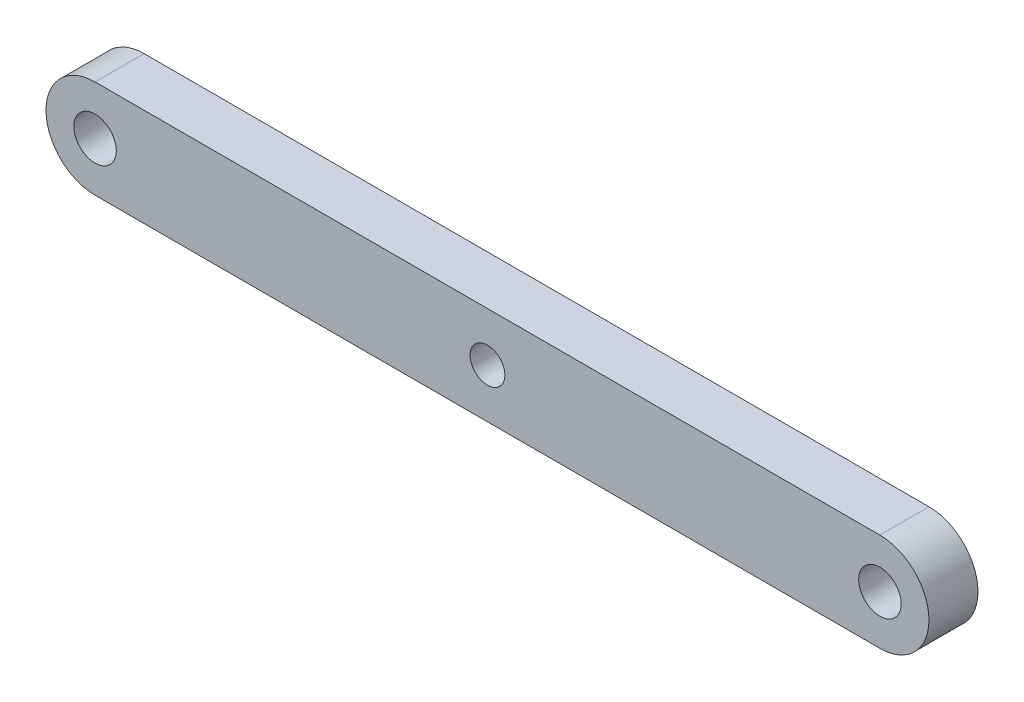
ISO-10303-21;
HEADER;
FILE_DESCRIPTION(('STEP AP214'),'2;1');
FILE_NAME('part.step','',(''),(''),'','','');
FILE_SCHEMA(('AUTOMOTIVE_DESIGN { 1 0 10303 214 1 1 1 1 }'));
ENDSEC;
DATA;
#1=APPLICATION_CONTEXT('core data for automotive mechanical design processes');
#2=APPLICATION_PROTOCOL_DEFINITION('international standard','automotive_design',2000,#1);
#3=PRODUCT_CONTEXT('',#1,'mechanical');
#4=PRODUCT('Part','Part','',(#3));
#5=PRODUCT_RELATED_PRODUCT_CATEGORY('part','',(#4));
#6=PRODUCT_DEFINITION_FORMATION('','',#4);
#7=PRODUCT_DEFINITION_CONTEXT('part definition',#1,'design');
#8=PRODUCT_DEFINITION('design','',#6,#7);
#9=PRODUCT_DEFINITION_SHAPE('','',#8);
#10=(LENGTH_UNIT() NAMED_UNIT(*) SI_UNIT(.MILLI.,.METRE.));
#11=(NAMED_UNIT(*) PLANE_ANGLE_UNIT() SI_UNIT($,.RADIAN.));
#12=(NAMED_UNIT(*) SI_UNIT($,.STERADIAN.) SOLID_ANGLE_UNIT());
#13=UNCERTAINTY_MEASURE_WITH_UNIT(LENGTH_MEASURE(1.E-05),#10,'distance_accuracy_value','');
#14=(GEOMETRIC_REPRESENTATION_CONTEXT(3) GLOBAL_UNCERTAINTY_ASSIGNED_CONTEXT((#13)) GLOBAL_UNIT_ASSIGNED_CONTEXT((#10,
#11,#12)) REPRESENTATION_CONTEXT('',''));
#15=CARTESIAN_POINT('',(0.,0.,0.));
#16=DIRECTION('',(0.,0.,1.));
#17=DIRECTION('',(1.,0.,0.));
#18=AXIS2_PLACEMENT_3D('',#15,#16,#17);
#19=CARTESIAN_POINT('',(0.,0.,6.35));
#20=DIRECTION('',(0.,0.,-1.));
#21=DIRECTION('',(-1.,0.,0.));
#22=AXIS2_PLACEMENT_3D('',#19,#20,#21);
#23=CYLINDRICAL_SURFACE('',#22,6.35);
#24=CARTESIAN_POINT('',(0.,0.,0.));
#25=DIRECTION('',(0.,0.,1.));
#26=DIRECTION('',(1.,0.,0.));
#27=AXIS2_PLACEMENT_3D('',#24,#25,#26);
#28=CIRCLE('',#27,6.35);
#29=CARTESIAN_POINT('',(0.,6.35,0.));
#30=VERTEX_POINT('',#29);
#31=CARTESIAN_POINT('',(0.,-6.35,0.));
#32=VERTEX_POINT('',#31);
#33=EDGE_CURVE('E96',#30,#32,#28,.T.);
#34=ORIENTED_EDGE('',*,*,#33,.T.);
#35=DIRECTION('',(0.,0.,-1.));
#36=VECTOR('',#35,1.);
#37=CARTESIAN_POINT('',(0.,-6.35,6.35));
#38=LINE('',#37,#36);
#39=CARTESIAN_POINT('',(0.,-6.35,6.35));
#40=VERTEX_POINT('',#39);
#41=EDGE_CURVE('E11',#40,#32,#38,.T.);
#42=ORIENTED_EDGE('',*,*,#41,.F.);
#43=CARTESIAN_POINT('',(0.,0.,6.35));
#44=DIRECTION('',(0.,0.,1.));
#45=DIRECTION('',(1.,0.,0.));
#46=AXIS2_PLACEMENT_3D('',#43,#44,#45);
#47=CIRCLE('',#46,6.35);
#48=CARTESIAN_POINT('',(0.,6.35,6.35));
#49=VERTEX_POINT('',#48);
#50=EDGE_CURVE('E84',#49,#40,#47,.T.);
#51=ORIENTED_EDGE('',*,*,#50,.F.);
#52=DIRECTION('',(0.,0.,-1.));
#53=VECTOR('',#52,1.);
#54=CARTESIAN_POINT('',(0.,6.35,6.35));
#55=LINE('',#54,#53);
#56=EDGE_CURVE('E92',#49,#30,#55,.T.);
#57=ORIENTED_EDGE('',*,*,#56,.T.);
#58=EDGE_LOOP('',(#34,#42,#51,#57));
#59=FACE_BOUND('',#58,.T.);
#60=ADVANCED_FACE('F33',(#59),#23,.T.);
#61=CARTESIAN_POINT('',(0.,-6.35,6.35));
#62=DIRECTION('',(0.,1.,0.));
#63=DIRECTION('',(0.,0.,1.));
#64=AXIS2_PLACEMENT_3D('',#61,#62,#63);
#65=PLANE('',#64);
#66=DIRECTION('',(1.,0.,0.));
#67=VECTOR('',#66,1.);
#68=CARTESIAN_POINT('',(0.,-6.35,0.));
#69=LINE('',#68,#67);
#70=CARTESIAN_POINT('',(101.6,-6.35,0.));
#71=VERTEX_POINT('',#70);
#72=EDGE_CURVE('E88',#32,#71,#69,.T.);
#73=ORIENTED_EDGE('',*,*,#72,.T.);
#74=DIRECTION('',(0.,0.,-1.));
#75=VECTOR('',#74,1.);
#76=CARTESIAN_POINT('',(101.6,-6.35,6.35));
#77=LINE('',#76,#75);
#78=CARTESIAN_POINT('',(101.6,-6.35,6.35));
#79=VERTEX_POINT('',#78);
#80=EDGE_CURVE('E41',#79,#71,#77,.T.);
#81=ORIENTED_EDGE('',*,*,#80,.F.);
#82=DIRECTION('',(1.,0.,0.));
#83=VECTOR('',#82,1.);
#84=CARTESIAN_POINT('',(0.,-6.35,6.35));
#85=LINE('',#84,#83);
#86=EDGE_CURVE('E79',#40,#79,#85,.T.);
#87=ORIENTED_EDGE('',*,*,#86,.F.);
#88=ORIENTED_EDGE('',*,*,#41,.T.);
#89=EDGE_LOOP('',(#73,#81,#87,#88));
#90=FACE_BOUND('',#89,.T.);
#91=ADVANCED_FACE('F87',(#90),#65,.F.);
#92=CARTESIAN_POINT('',(101.6,0.,6.35));
#93=DIRECTION('',(0.,0.,-1.));
#94=DIRECTION('',(-1.,0.,0.));
#95=AXIS2_PLACEMENT_3D('',#92,#93,#94);
#96=CYLINDRICAL_SURFACE('',#95,6.35);
#97=CARTESIAN_POINT('',(101.6,0.,0.));
#98=DIRECTION('',(0.,0.,1.));
#99=DIRECTION('',(1.,0.,0.));
#100=AXIS2_PLACEMENT_3D('',#97,#98,#99);
#101=CIRCLE('',#100,6.35);
#102=CARTESIAN_POINT('',(101.6,6.35,0.));
#103=VERTEX_POINT('',#102);
#104=EDGE_CURVE('E66',#71,#103,#101,.T.);
#105=ORIENTED_EDGE('',*,*,#104,.T.);
#106=DIRECTION('',(0.,0.,-1.));
#107=VECTOR('',#106,1.);
#108=CARTESIAN_POINT('',(101.6,6.35,6.35));
#109=LINE('',#108,#107);
#110=CARTESIAN_POINT('',(101.6,6.35,6.35));
#111=VERTEX_POINT('',#110);
#112=EDGE_CURVE('E89',#111,#103,#109,.T.);
#113=ORIENTED_EDGE('',*,*,#112,.F.);
#114=CARTESIAN_POINT('',(101.6,0.,6.35));
#115=DIRECTION('',(0.,0.,1.));
#116=DIRECTION('',(1.,0.,0.));
#117=AXIS2_PLACEMENT_3D('',#114,#115,#116);
#118=CIRCLE('',#117,6.35);
#119=EDGE_CURVE('E82',#79,#111,#118,.T.);
#120=ORIENTED_EDGE('',*,*,#119,.F.);
#121=ORIENTED_EDGE('',*,*,#80,.T.);
#122=EDGE_LOOP('',(#105,#113,#120,#121));
#123=FACE_BOUND('',#122,.T.);
#124=ADVANCED_FACE('F90',(#123),#96,.T.);
#125=CARTESIAN_POINT('',(0.,6.35,6.35));
#126=DIRECTION('',(0.,-1.,0.));
#127=DIRECTION('',(0.,0.,-1.));
#128=AXIS2_PLACEMENT_3D('',#125,#126,#127);
#129=PLANE('',#128);
#130=DIRECTION('',(-1.,0.,0.));
#131=VECTOR('',#130,1.);
#132=CARTESIAN_POINT('',(0.,6.35,0.));
#133=LINE('',#132,#131);
#134=EDGE_CURVE('E72',#103,#30,#133,.T.);
#135=ORIENTED_EDGE('',*,*,#134,.T.);
#136=ORIENTED_EDGE('',*,*,#56,.F.);
#137=DIRECTION('',(-1.,0.,0.));
#138=VECTOR('',#137,1.);
#139=CARTESIAN_POINT('',(0.,6.35,6.35));
#140=LINE('',#139,#138);
#141=EDGE_CURVE('E49',#111,#49,#140,.T.);
#142=ORIENTED_EDGE('',*,*,#141,.F.);
#143=ORIENTED_EDGE('',*,*,#112,.T.);
#144=EDGE_LOOP('',(#135,#136,#142,#143));
#145=FACE_BOUND('',#144,.T.);
#146=ADVANCED_FACE('F104',(#145),#129,.F.);
#147=CARTESIAN_POINT('',(0.,0.,6.35));
#148=DIRECTION('',(0.,0.,1.));
#149=DIRECTION('',(1.,0.,0.));
#150=AXIS2_PLACEMENT_3D('',#147,#148,#149);
#151=PLANE('',#150);
#152=CARTESIAN_POINT('',(0.,0.,6.35));
#153=DIRECTION('',(0.,0.,1.));
#154=DIRECTION('',(1.,0.,0.));
#155=AXIS2_PLACEMENT_3D('',#152,#153,#154);
#156=CIRCLE('',#155,2.75);
#157=CARTESIAN_POINT('',(2.75,0.,6.35));
#158=VERTEX_POINT('',#157);
#159=EDGE_CURVE('E124',#158,#158,#156,.T.);
#160=ORIENTED_EDGE('',*,*,#159,.F.);
#161=EDGE_LOOP('',(#160));
#162=FACE_BOUND('',#161,.T.);
#163=CARTESIAN_POINT('',(50.8,0.,6.35));
#164=DIRECTION('',(0.,0.,-1.));
#165=DIRECTION('',(-1.,0.,0.));
#166=AXIS2_PLACEMENT_3D('',#163,#164,#165);
#167=CIRCLE('',#166,2.25);
#168=CARTESIAN_POINT('',(48.55,0.,6.35));
#169=VERTEX_POINT('',#168);
#170=EDGE_CURVE('E115',#169,#169,#167,.T.);
#171=ORIENTED_EDGE('',*,*,#170,.T.);
#172=EDGE_LOOP('',(#171));
#173=FACE_BOUND('',#172,.T.);
#174=CARTESIAN_POINT('',(101.6,0.,6.35));
#175=DIRECTION('',(0.,0.,-1.));
#176=DIRECTION('',(-1.,0.,0.));
#177=AXIS2_PLACEMENT_3D('',#174,#175,#176);
#178=CIRCLE('',#177,2.75);
#179=CARTESIAN_POINT('',(98.85,0.,6.35));
#180=VERTEX_POINT('',#179);
#181=EDGE_CURVE('E99',#180,#180,#178,.T.);
#182=ORIENTED_EDGE('',*,*,#181,.T.);
#183=EDGE_LOOP('',(#182));
#184=FACE_BOUND('',#183,.T.);
#185=ORIENTED_EDGE('',*,*,#50,.T.);
#186=ORIENTED_EDGE('',*,*,#86,.T.);
#187=ORIENTED_EDGE('',*,*,#119,.T.);
#188=ORIENTED_EDGE('',*,*,#141,.T.);
#189=EDGE_LOOP('',(#185,#186,#187,#188));
#190=FACE_BOUND('',#189,.T.);
#191=ADVANCED_FACE('F80',(#162,#173,#184,#190),#151,.T.);
#192=CARTESIAN_POINT('',(0.,0.,0.));
#193=DIRECTION('',(0.,0.,1.));
#194=DIRECTION('',(1.,0.,0.));
#195=AXIS2_PLACEMENT_3D('',#192,#193,#194);
#196=PLANE('',#195);
#197=CARTESIAN_POINT('',(0.,0.,0.));
#198=DIRECTION('',(0.,0.,1.));
#199=DIRECTION('',(1.,0.,0.));
#200=AXIS2_PLACEMENT_3D('',#197,#198,#199);
#201=CIRCLE('',#200,2.75);
#202=CARTESIAN_POINT('',(2.75,0.,0.));
#203=VERTEX_POINT('',#202);
#204=EDGE_CURVE('E121',#203,#203,#201,.T.);
#205=ORIENTED_EDGE('',*,*,#204,.T.);
#206=EDGE_LOOP('',(#205));
#207=FACE_BOUND('',#206,.T.);
#208=CARTESIAN_POINT('',(50.8,0.,0.));
#209=DIRECTION('',(0.,0.,-1.));
#210=DIRECTION('',(-1.,0.,0.));
#211=AXIS2_PLACEMENT_3D('',#208,#209,#210);
#212=CIRCLE('',#211,2.25);
#213=CARTESIAN_POINT('',(48.55,0.,0.));
#214=VERTEX_POINT('',#213);
#215=EDGE_CURVE('E118',#214,#214,#212,.T.);
#216=ORIENTED_EDGE('',*,*,#215,.F.);
#217=EDGE_LOOP('',(#216));
#218=FACE_BOUND('',#217,.T.);
#219=CARTESIAN_POINT('',(101.6,0.,0.));
#220=DIRECTION('',(0.,0.,-1.));
#221=DIRECTION('',(-1.,0.,0.));
#222=AXIS2_PLACEMENT_3D('',#219,#220,#221);
#223=CIRCLE('',#222,2.74999999999999);
#224=CARTESIAN_POINT('',(98.85,0.,0.));
#225=VERTEX_POINT('',#224);
#226=EDGE_CURVE('E112',#225,#225,#223,.T.);
#227=ORIENTED_EDGE('',*,*,#226,.F.);
#228=EDGE_LOOP('',(#227));
#229=FACE_BOUND('',#228,.T.);
#230=ORIENTED_EDGE('',*,*,#33,.F.);
#231=ORIENTED_EDGE('',*,*,#134,.F.);
#232=ORIENTED_EDGE('',*,*,#104,.F.);
#233=ORIENTED_EDGE('',*,*,#72,.F.);
#234=EDGE_LOOP('',(#230,#231,#232,#233));
#235=FACE_BOUND('',#234,.T.);
#236=ADVANCED_FACE('F107',(#207,#218,#229,#235),#196,.F.);
#237=CARTESIAN_POINT('',(101.6,0.,0.));
#238=DIRECTION('',(0.,0.,-1.));
#239=DIRECTION('',(-1.,0.,0.));
#240=AXIS2_PLACEMENT_3D('',#237,#238,#239);
#241=CYLINDRICAL_SURFACE('',#240,2.75);
#242=ORIENTED_EDGE('',*,*,#181,.F.);
#243=EDGE_LOOP('',(#242));
#244=FACE_BOUND('',#243,.T.);
#245=ORIENTED_EDGE('',*,*,#226,.T.);
#246=EDGE_LOOP('',(#245));
#247=FACE_BOUND('',#246,.T.);
#248=ADVANCED_FACE('F137',(#244,#247),#241,.F.);
#249=CARTESIAN_POINT('',(50.8,0.,0.));
#250=DIRECTION('',(0.,0.,-1.));
#251=DIRECTION('',(-1.,0.,0.));
#252=AXIS2_PLACEMENT_3D('',#249,#250,#251);
#253=CYLINDRICAL_SURFACE('',#252,2.25);
#254=ORIENTED_EDGE('',*,*,#170,.F.);
#255=EDGE_LOOP('',(#254));
#256=FACE_BOUND('',#255,.T.);
#257=ORIENTED_EDGE('',*,*,#215,.T.);
#258=EDGE_LOOP('',(#257));
#259=FACE_BOUND('',#258,.T.);
#260=ADVANCED_FACE('F140',(#256,#259),#253,.F.);
#261=CARTESIAN_POINT('',(0.,0.,6.35));
#262=DIRECTION('',(0.,0.,1.));
#263=DIRECTION('',(1.,0.,0.));
#264=AXIS2_PLACEMENT_3D('',#261,#262,#263);
#265=CYLINDRICAL_SURFACE('',#264,2.75);
#266=ORIENTED_EDGE('',*,*,#204,.F.);
#267=EDGE_LOOP('',(#266));
#268=FACE_BOUND('',#267,.T.);
#269=ORIENTED_EDGE('',*,*,#159,.T.);
#270=EDGE_LOOP('',(#269));
#271=FACE_BOUND('',#270,.T.);
#272=ADVANCED_FACE('F128',(#268,#271),#265,.F.);
#273=CLOSED_SHELL('',(#60,#91,#124,#146,#191,#236,#248,#260,#272));
#274=MANIFOLD_SOLID_BREP('B2',#273);
#275=ADVANCED_BREP_SHAPE_REPRESENTATION('',(#18,#274),#14);
#276=SHAPE_DEFINITION_REPRESENTATION(#9,#275);
ENDSEC;
END-ISO-10303-21;
